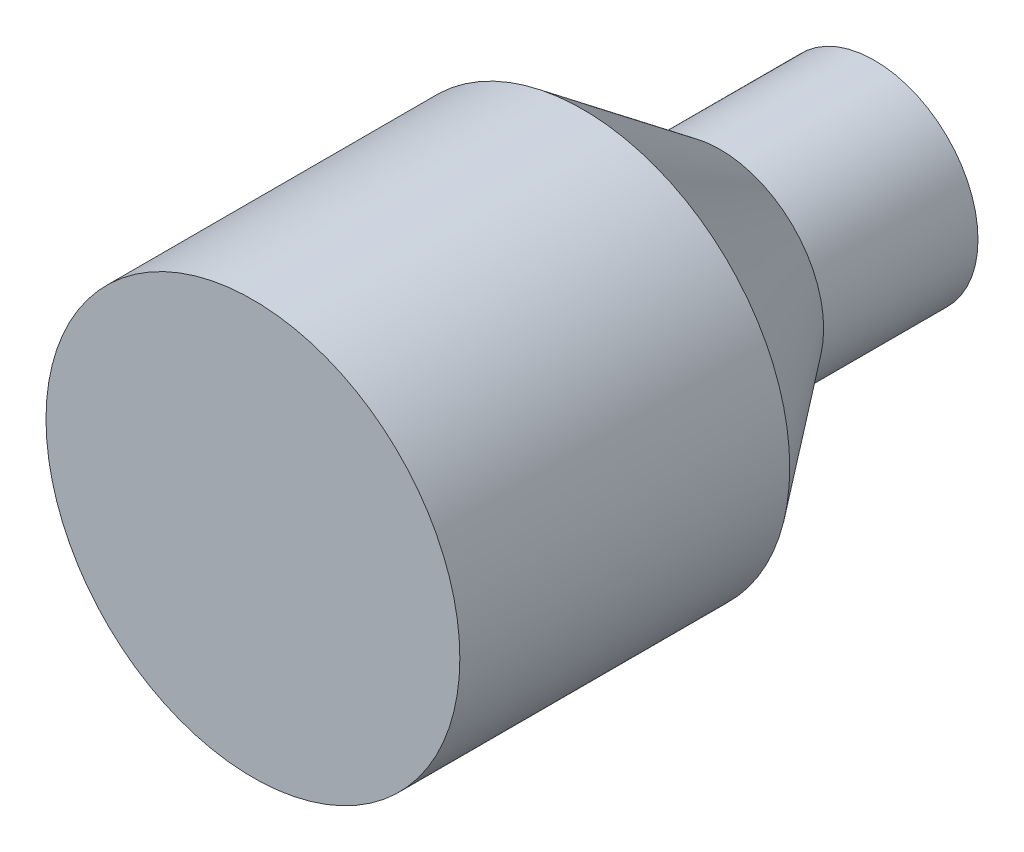
ISO-10303-21;
HEADER;
FILE_DESCRIPTION(('STEP AP214'),'2;1');
FILE_NAME('part.step','',(''),(''),'','','');
FILE_SCHEMA(('AUTOMOTIVE_DESIGN { 1 0 10303 214 1 1 1 1 }'));
ENDSEC;
DATA;
#1=APPLICATION_CONTEXT('core data for automotive mechanical design processes');
#2=APPLICATION_PROTOCOL_DEFINITION('international standard','automotive_design',2000,#1);
#3=PRODUCT_CONTEXT('',#1,'mechanical');
#4=PRODUCT('Part','Part','',(#3));
#5=PRODUCT_RELATED_PRODUCT_CATEGORY('part','',(#4));
#6=PRODUCT_DEFINITION_FORMATION('','',#4);
#7=PRODUCT_DEFINITION_CONTEXT('part definition',#1,'design');
#8=PRODUCT_DEFINITION('design','',#6,#7);
#9=PRODUCT_DEFINITION_SHAPE('','',#8);
#10=(LENGTH_UNIT() NAMED_UNIT(*) SI_UNIT(.MILLI.,.METRE.));
#11=(NAMED_UNIT(*) PLANE_ANGLE_UNIT() SI_UNIT($,.RADIAN.));
#12=(NAMED_UNIT(*) SI_UNIT($,.STERADIAN.) SOLID_ANGLE_UNIT());
#13=UNCERTAINTY_MEASURE_WITH_UNIT(LENGTH_MEASURE(1.E-05),#10,'distance_accuracy_value','');
#14=(GEOMETRIC_REPRESENTATION_CONTEXT(3) GLOBAL_UNCERTAINTY_ASSIGNED_CONTEXT((#13)) GLOBAL_UNIT_ASSIGNED_CONTEXT((#10,
#11,#12)) REPRESENTATION_CONTEXT('',''));
#15=CARTESIAN_POINT('',(0.,0.,0.));
#16=DIRECTION('',(0.,0.,1.));
#17=DIRECTION('',(1.,0.,0.));
#18=AXIS2_PLACEMENT_3D('',#15,#16,#17);
#19=CARTESIAN_POINT('',(0.,0.,0.));
#20=DIRECTION('',(0.,0.,1.));
#21=DIRECTION('',(1.,0.,0.));
#22=AXIS2_PLACEMENT_3D('',#19,#20,#21);
#23=PLANE('',#22);
#24=CARTESIAN_POINT('',(0.,0.,0.));
#25=DIRECTION('',(0.,0.,1.));
#26=DIRECTION('',(1.,0.,0.));
#27=AXIS2_PLACEMENT_3D('',#24,#25,#26);
#28=CIRCLE('',#27,33.6260066436527);
#29=CARTESIAN_POINT('',(33.6260066436527,0.,0.));
#30=VERTEX_POINT('',#29);
#31=EDGE_CURVE('E10',#30,#30,#28,.T.);
#32=ORIENTED_EDGE('',*,*,#31,.T.);
#33=EDGE_LOOP('',(#32));
#34=FACE_BOUND('',#33,.T.);
#35=ADVANCED_FACE('F33',(#34),#23,.T.);
#36=CARTESIAN_POINT('',(0.,0.,0.));
#37=DIRECTION('',(0.,0.,1.));
#38=DIRECTION('',(1.,0.,0.));
#39=AXIS2_PLACEMENT_3D('',#36,#37,#38);
#40=CYLINDRICAL_SURFACE('',#39,33.6260066436527);
#41=CARTESIAN_POINT('',(0.,0.,-53.6086745261512));
#42=DIRECTION('',(0.,0.,1.));
#43=DIRECTION('',(1.,0.,0.));
#44=AXIS2_PLACEMENT_3D('',#41,#42,#43);
#45=CIRCLE('',#44,33.6260066436527);
#46=CARTESIAN_POINT('',(33.6260066436527,0.,-53.6086745261512));
#47=VERTEX_POINT('',#46);
#48=EDGE_CURVE('E39',#47,#47,#45,.T.);
#49=ORIENTED_EDGE('',*,*,#48,.T.);
#50=EDGE_LOOP('',(#49));
#51=FACE_BOUND('',#50,.T.);
#52=ORIENTED_EDGE('',*,*,#31,.F.);
#53=EDGE_LOOP('',(#52));
#54=FACE_BOUND('',#53,.T.);
#55=ADVANCED_FACE('F65',(#51,#54),#40,.T.);
#56=CARTESIAN_POINT('',(0.,0.,-53.6086745261512));
#57=DIRECTION('',(0.,0.,1.));
#58=DIRECTION('',(1.,0.,0.));
#59=AXIS2_PLACEMENT_3D('',#56,#57,#58);
#60=CONICAL_SURFACE('',#59,33.6260066436527,0.64547349282333);
#61=CARTESIAN_POINT('',(0.,0.,-75.9341379534944));
#62=DIRECTION('',(0.,0.,1.));
#63=DIRECTION('',(1.,0.,0.));
#64=AXIS2_PLACEMENT_3D('',#61,#62,#63);
#65=CIRCLE('',#64,16.8130033218264);
#66=CARTESIAN_POINT('',(16.8130033218264,0.,-75.9341379534944));
#67=VERTEX_POINT('',#66);
#68=EDGE_CURVE('E43',#67,#67,#65,.T.);
#69=ORIENTED_EDGE('',*,*,#68,.T.);
#70=EDGE_LOOP('',(#69));
#71=FACE_BOUND('',#70,.T.);
#72=ORIENTED_EDGE('',*,*,#48,.F.);
#73=EDGE_LOOP('',(#72));
#74=FACE_BOUND('',#73,.T.);
#75=ADVANCED_FACE('F62',(#71,#74),#60,.T.);
#76=CARTESIAN_POINT('',(0.,0.,0.));
#77=DIRECTION('',(0.,0.,1.));
#78=DIRECTION('',(1.,0.,0.));
#79=AXIS2_PLACEMENT_3D('',#76,#77,#78);
#80=CYLINDRICAL_SURFACE('',#79,16.8130033218264);
#81=CARTESIAN_POINT('',(0.,0.,-101.015831433596));
#82=DIRECTION('',(0.,0.,1.));
#83=DIRECTION('',(1.,0.,0.));
#84=AXIS2_PLACEMENT_3D('',#81,#82,#83);
#85=CIRCLE('',#84,16.8130033218264);
#86=CARTESIAN_POINT('',(16.8130033218264,0.,-101.015831433596));
#87=VERTEX_POINT('',#86);
#88=EDGE_CURVE('E47',#87,#87,#85,.T.);
#89=ORIENTED_EDGE('',*,*,#88,.T.);
#90=EDGE_LOOP('',(#89));
#91=FACE_BOUND('',#90,.T.);
#92=ORIENTED_EDGE('',*,*,#68,.F.);
#93=EDGE_LOOP('',(#92));
#94=FACE_BOUND('',#93,.T.);
#95=ADVANCED_FACE('F53',(#91,#94),#80,.T.);
#96=CARTESIAN_POINT('',(16.8130033218264,0.,-101.015831433596));
#97=DIRECTION('',(0.,0.,-1.));
#98=DIRECTION('',(-1.,0.,0.));
#99=AXIS2_PLACEMENT_3D('',#96,#97,#98);
#100=PLANE('',#99);
#101=ORIENTED_EDGE('',*,*,#88,.F.);
#102=EDGE_LOOP('',(#101));
#103=FACE_BOUND('',#102,.T.);
#104=ADVANCED_FACE('F56',(#103),#100,.T.);
#105=CLOSED_SHELL('',(#35,#55,#75,#95,#104));
#106=MANIFOLD_SOLID_BREP('B2',#105);
#107=ADVANCED_BREP_SHAPE_REPRESENTATION('',(#18,#106),#14);
#108=SHAPE_DEFINITION_REPRESENTATION(#9,#107);
ENDSEC;
END-ISO-10303-21;
